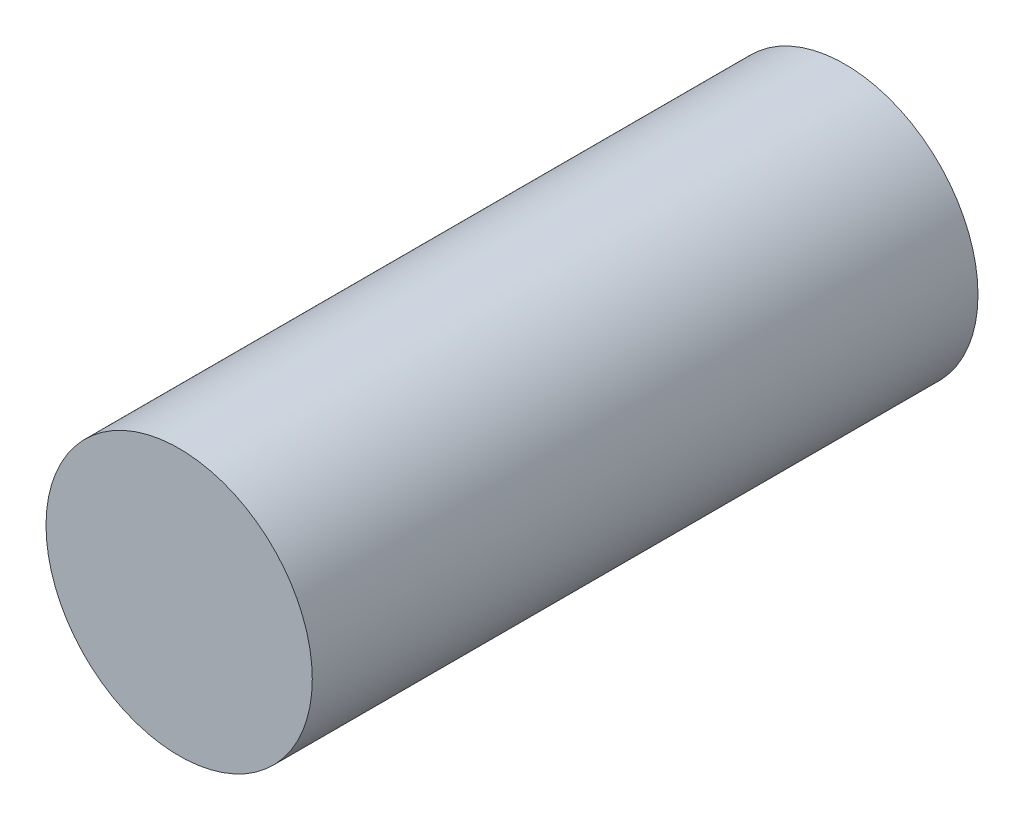
ISO-10303-21;
HEADER;
FILE_DESCRIPTION(('STEP AP214'),'2;1');
FILE_NAME('part.step','',(''),(''),'','','');
FILE_SCHEMA(('AUTOMOTIVE_DESIGN { 1 0 10303 214 1 1 1 1 }'));
ENDSEC;
DATA;
#1=APPLICATION_CONTEXT('core data for automotive mechanical design processes');
#2=APPLICATION_PROTOCOL_DEFINITION('international standard','automotive_design',2000,#1);
#3=PRODUCT_CONTEXT('',#1,'mechanical');
#4=PRODUCT('Part','Part','',(#3));
#5=PRODUCT_RELATED_PRODUCT_CATEGORY('part','',(#4));
#6=PRODUCT_DEFINITION_FORMATION('','',#4);
#7=PRODUCT_DEFINITION_CONTEXT('part definition',#1,'design');
#8=PRODUCT_DEFINITION('design','',#6,#7);
#9=PRODUCT_DEFINITION_SHAPE('','',#8);
#10=(LENGTH_UNIT() NAMED_UNIT(*) SI_UNIT(.MILLI.,.METRE.));
#11=(NAMED_UNIT(*) PLANE_ANGLE_UNIT() SI_UNIT($,.RADIAN.));
#12=(NAMED_UNIT(*) SI_UNIT($,.STERADIAN.) SOLID_ANGLE_UNIT());
#13=UNCERTAINTY_MEASURE_WITH_UNIT(LENGTH_MEASURE(1.E-05),#10,'distance_accuracy_value','');
#14=(GEOMETRIC_REPRESENTATION_CONTEXT(3) GLOBAL_UNCERTAINTY_ASSIGNED_CONTEXT((#13)) GLOBAL_UNIT_ASSIGNED_CONTEXT((#10,
#11,#12)) REPRESENTATION_CONTEXT('',''));
#15=CARTESIAN_POINT('',(0.,0.,0.));
#16=DIRECTION('',(0.,0.,1.));
#17=DIRECTION('',(1.,0.,0.));
#18=AXIS2_PLACEMENT_3D('',#15,#16,#17);
#19=CARTESIAN_POINT('',(0.,0.,100.));
#20=DIRECTION('',(0.,0.,-1.));
#21=DIRECTION('',(-1.,0.,0.));
#22=AXIS2_PLACEMENT_3D('',#19,#20,#21);
#23=CYLINDRICAL_SURFACE('',#22,20.);
#24=CARTESIAN_POINT('',(0.,0.,100.));
#25=DIRECTION('',(0.,0.,1.));
#26=DIRECTION('',(1.,0.,0.));
#27=AXIS2_PLACEMENT_3D('',#24,#25,#26);
#28=CIRCLE('',#27,20.);
#29=CARTESIAN_POINT('',(20.,0.,100.));
#30=VERTEX_POINT('',#29);
#31=EDGE_CURVE('E10',#30,#30,#28,.T.);
#32=ORIENTED_EDGE('',*,*,#31,.F.);
#33=EDGE_LOOP('',(#32));
#34=FACE_BOUND('',#33,.T.);
#35=CARTESIAN_POINT('',(0.,0.,0.));
#36=DIRECTION('',(0.,0.,1.));
#37=DIRECTION('',(1.,0.,0.));
#38=AXIS2_PLACEMENT_3D('',#35,#36,#37);
#39=CIRCLE('',#38,20.);
#40=CARTESIAN_POINT('',(20.,0.,0.));
#41=VERTEX_POINT('',#40);
#42=EDGE_CURVE('E38',#41,#41,#39,.T.);
#43=ORIENTED_EDGE('',*,*,#42,.T.);
#44=EDGE_LOOP('',(#43));
#45=FACE_BOUND('',#44,.T.);
#46=ADVANCED_FACE('F35',(#34,#45),#23,.T.);
#47=CARTESIAN_POINT('',(0.,0.,100.));
#48=DIRECTION('',(0.,0.,1.));
#49=DIRECTION('',(1.,0.,0.));
#50=AXIS2_PLACEMENT_3D('',#47,#48,#49);
#51=PLANE('',#50);
#52=ORIENTED_EDGE('',*,*,#31,.T.);
#53=EDGE_LOOP('',(#52));
#54=FACE_BOUND('',#53,.T.);
#55=ADVANCED_FACE('F50',(#54),#51,.T.);
#56=CARTESIAN_POINT('',(0.,0.,0.));
#57=DIRECTION('',(0.,0.,1.));
#58=DIRECTION('',(1.,0.,0.));
#59=AXIS2_PLACEMENT_3D('',#56,#57,#58);
#60=PLANE('',#59);
#61=ORIENTED_EDGE('',*,*,#42,.F.);
#62=EDGE_LOOP('',(#61));
#63=FACE_BOUND('',#62,.T.);
#64=ADVANCED_FACE('F48',(#63),#60,.F.);
#65=CLOSED_SHELL('',(#46,#55,#64));
#66=MANIFOLD_SOLID_BREP('B2',#65);
#67=ADVANCED_BREP_SHAPE_REPRESENTATION('',(#18,#66),#14);
#68=SHAPE_DEFINITION_REPRESENTATION(#9,#67);
ENDSEC;
END-ISO-10303-21;
